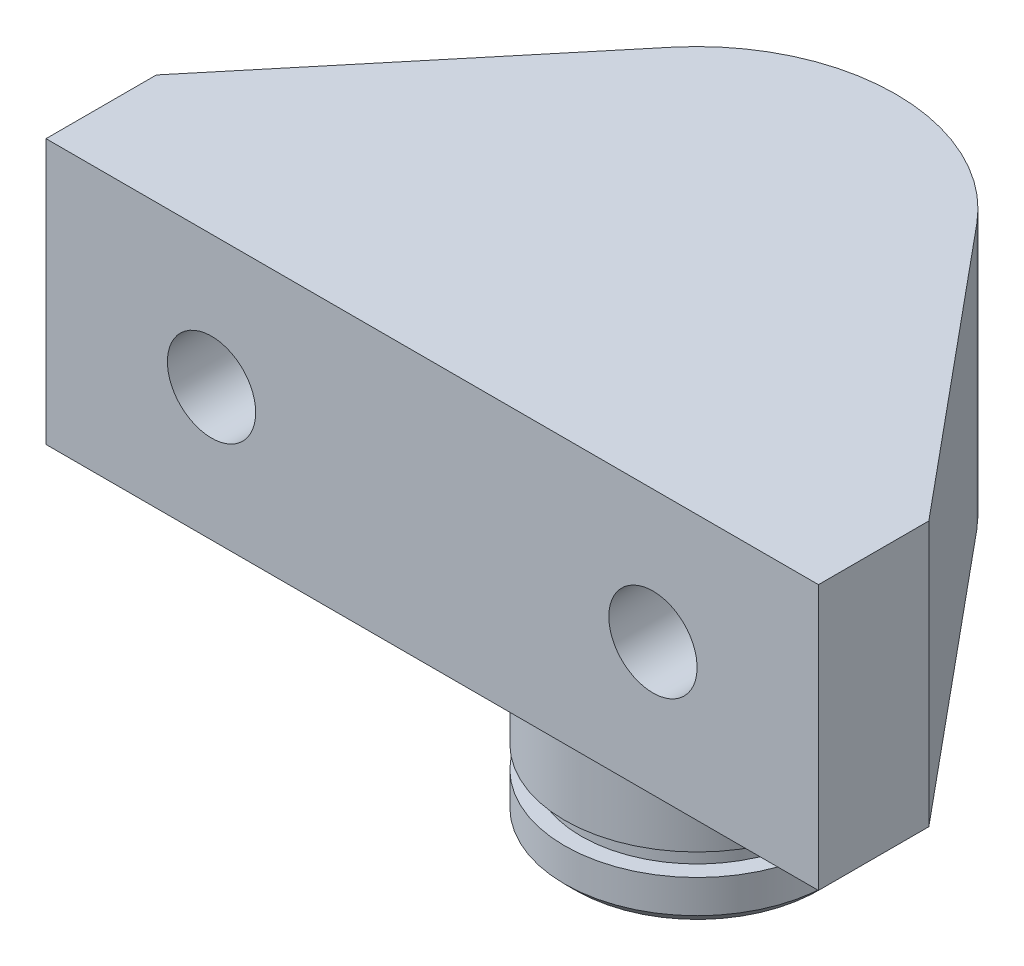
ISO-10303-21;
HEADER;
FILE_DESCRIPTION(('STEP AP214'),'2;1');
FILE_NAME('part.step','',(''),(''),'','','');
FILE_SCHEMA(('AUTOMOTIVE_DESIGN { 1 0 10303 214 1 1 1 1 }'));
ENDSEC;
DATA;
#1=APPLICATION_CONTEXT('core data for automotive mechanical design processes');
#2=APPLICATION_PROTOCOL_DEFINITION('international standard','automotive_design',2000,#1);
#3=PRODUCT_CONTEXT('',#1,'mechanical');
#4=PRODUCT('Part','Part','',(#3));
#5=PRODUCT_RELATED_PRODUCT_CATEGORY('part','',(#4));
#6=PRODUCT_DEFINITION_FORMATION('','',#4);
#7=PRODUCT_DEFINITION_CONTEXT('part definition',#1,'design');
#8=PRODUCT_DEFINITION('design','',#6,#7);
#9=PRODUCT_DEFINITION_SHAPE('','',#8);
#10=(LENGTH_UNIT() NAMED_UNIT(*) SI_UNIT(.MILLI.,.METRE.));
#11=(NAMED_UNIT(*) PLANE_ANGLE_UNIT() SI_UNIT($,.RADIAN.));
#12=(NAMED_UNIT(*) SI_UNIT($,.STERADIAN.) SOLID_ANGLE_UNIT());
#13=UNCERTAINTY_MEASURE_WITH_UNIT(LENGTH_MEASURE(1.E-05),#10,'distance_accuracy_value','');
#14=(GEOMETRIC_REPRESENTATION_CONTEXT(3) GLOBAL_UNCERTAINTY_ASSIGNED_CONTEXT((#13)) GLOBAL_UNIT_ASSIGNED_CONTEXT((#10,
#11,#12)) REPRESENTATION_CONTEXT('',''));
#15=CARTESIAN_POINT('',(0.,0.,0.));
#16=DIRECTION('',(0.,0.,1.));
#17=DIRECTION('',(1.,0.,0.));
#18=AXIS2_PLACEMENT_3D('',#15,#16,#17);
#19=CARTESIAN_POINT('',(-17.5,12.,-6.09769995019883));
#20=DIRECTION('',(1.,0.,0.));
#21=DIRECTION('',(0.,0.,-1.));
#22=AXIS2_PLACEMENT_3D('',#19,#20,#21);
#23=PLANE('',#22);
#24=DIRECTION('',(0.,0.,1.));
#25=VECTOR('',#24,1.);
#26=CARTESIAN_POINT('',(-17.5,0.,-6.09769995019883));
#27=LINE('',#26,#25);
#28=CARTESIAN_POINT('',(-17.5,0.,-6.09769995019883));
#29=VERTEX_POINT('',#28);
#30=CARTESIAN_POINT('',(-17.5,0.,-1.09769995019883));
#31=VERTEX_POINT('',#30);
#32=EDGE_CURVE('E123',#29,#31,#27,.T.);
#33=ORIENTED_EDGE('',*,*,#32,.T.);
#34=DIRECTION('',(0.,-1.,0.));
#35=VECTOR('',#34,1.);
#36=CARTESIAN_POINT('',(-17.5,12.,-1.09769995019883));
#37=LINE('',#36,#35);
#38=CARTESIAN_POINT('',(-17.5,12.,-1.09769995019883));
#39=VERTEX_POINT('',#38);
#40=EDGE_CURVE('E141',#39,#31,#37,.T.);
#41=ORIENTED_EDGE('',*,*,#40,.F.);
#42=DIRECTION('',(0.,0.,1.));
#43=VECTOR('',#42,1.);
#44=CARTESIAN_POINT('',(-17.5,12.,-6.09769995019883));
#45=LINE('',#44,#43);
#46=CARTESIAN_POINT('',(-17.5,12.,-6.09769995019883));
#47=VERTEX_POINT('',#46);
#48=EDGE_CURVE('E134',#47,#39,#45,.T.);
#49=ORIENTED_EDGE('',*,*,#48,.F.);
#50=DIRECTION('',(0.,-1.,0.));
#51=VECTOR('',#50,1.);
#52=CARTESIAN_POINT('',(-17.5,12.,-6.09769995019883));
#53=LINE('',#52,#51);
#54=EDGE_CURVE('E119',#47,#29,#53,.T.);
#55=ORIENTED_EDGE('',*,*,#54,.T.);
#56=EDGE_LOOP('',(#33,#41,#49,#55));
#57=FACE_BOUND('',#56,.T.);
#58=ADVANCED_FACE('F37',(#57),#23,.F.);
#59=CARTESIAN_POINT('',(17.5,12.,-1.09769995019884));
#60=DIRECTION('',(0.,0.,-1.));
#61=DIRECTION('',(-1.,0.,0.));
#62=AXIS2_PLACEMENT_3D('',#59,#60,#61);
#63=PLANE('',#62);
#64=CARTESIAN_POINT('',(10.,6.,-1.09769995019883));
#65=DIRECTION('',(0.,0.,1.));
#66=DIRECTION('',(-1.,0.,0.));
#67=AXIS2_PLACEMENT_3D('',#64,#65,#66);
#68=CIRCLE('',#67,2.);
#69=CARTESIAN_POINT('',(8.,6.,-1.09769995019883));
#70=VERTEX_POINT('',#69);
#71=EDGE_CURVE('E227',#70,#70,#68,.T.);
#72=ORIENTED_EDGE('',*,*,#71,.F.);
#73=EDGE_LOOP('',(#72));
#74=FACE_BOUND('',#73,.T.);
#75=CARTESIAN_POINT('',(-10.,6.,-1.09769995019883));
#76=DIRECTION('',(0.,0.,1.));
#77=DIRECTION('',(1.,0.,0.));
#78=AXIS2_PLACEMENT_3D('',#75,#76,#77);
#79=CIRCLE('',#78,2.);
#80=CARTESIAN_POINT('',(-8.,6.,-1.09769995019883));
#81=VERTEX_POINT('',#80);
#82=EDGE_CURVE('E226',#81,#81,#79,.T.);
#83=ORIENTED_EDGE('',*,*,#82,.F.);
#84=EDGE_LOOP('',(#83));
#85=FACE_BOUND('',#84,.T.);
#86=DIRECTION('',(1.,0.,0.));
#87=VECTOR('',#86,1.);
#88=CARTESIAN_POINT('',(17.5,0.,-1.09769995019884));
#89=LINE('',#88,#87);
#90=CARTESIAN_POINT('',(17.5,0.,-1.09769995019884));
#91=VERTEX_POINT('',#90);
#92=EDGE_CURVE('E126',#31,#91,#89,.T.);
#93=ORIENTED_EDGE('',*,*,#92,.T.);
#94=DIRECTION('',(0.,-1.,0.));
#95=VECTOR('',#94,1.);
#96=CARTESIAN_POINT('',(17.5,12.,-1.09769995019884));
#97=LINE('',#96,#95);
#98=CARTESIAN_POINT('',(17.5,12.,-1.09769995019884));
#99=VERTEX_POINT('',#98);
#100=EDGE_CURVE('E138',#99,#91,#97,.T.);
#101=ORIENTED_EDGE('',*,*,#100,.F.);
#102=DIRECTION('',(1.,0.,0.));
#103=VECTOR('',#102,1.);
#104=CARTESIAN_POINT('',(17.5,12.,-1.09769995019884));
#105=LINE('',#104,#103);
#106=EDGE_CURVE('E92',#39,#99,#105,.T.);
#107=ORIENTED_EDGE('',*,*,#106,.F.);
#108=ORIENTED_EDGE('',*,*,#40,.T.);
#109=EDGE_LOOP('',(#93,#101,#107,#108));
#110=FACE_BOUND('',#109,.T.);
#111=ADVANCED_FACE('F168',(#74,#85,#110),#63,.F.);
#112=CARTESIAN_POINT('',(17.5,12.,-6.09769995019884));
#113=DIRECTION('',(-1.,0.,0.));
#114=DIRECTION('',(0.,0.,1.));
#115=AXIS2_PLACEMENT_3D('',#112,#113,#114);
#116=PLANE('',#115);
#117=DIRECTION('',(0.,0.,-1.));
#118=VECTOR('',#117,1.);
#119=CARTESIAN_POINT('',(17.5,0.,-6.09769995019884));
#120=LINE('',#119,#118);
#121=CARTESIAN_POINT('',(17.5,0.,-6.09769995019884));
#122=VERTEX_POINT('',#121);
#123=EDGE_CURVE('E129',#91,#122,#120,.T.);
#124=ORIENTED_EDGE('',*,*,#123,.T.);
#125=DIRECTION('',(0.,-1.,0.));
#126=VECTOR('',#125,1.);
#127=CARTESIAN_POINT('',(17.5,12.,-6.09769995019884));
#128=LINE('',#127,#126);
#129=CARTESIAN_POINT('',(17.5,12.,-6.09769995019884));
#130=VERTEX_POINT('',#129);
#131=EDGE_CURVE('E114',#130,#122,#128,.T.);
#132=ORIENTED_EDGE('',*,*,#131,.F.);
#133=DIRECTION('',(0.,0.,-1.));
#134=VECTOR('',#133,1.);
#135=CARTESIAN_POINT('',(17.5,12.,-6.09769995019884));
#136=LINE('',#135,#134);
#137=EDGE_CURVE('E105',#99,#130,#136,.T.);
#138=ORIENTED_EDGE('',*,*,#137,.F.);
#139=ORIENTED_EDGE('',*,*,#100,.T.);
#140=EDGE_LOOP('',(#124,#132,#138,#139));
#141=FACE_BOUND('',#140,.T.);
#142=ADVANCED_FACE('F173',(#141),#116,.F.);
#143=CARTESIAN_POINT('',(17.5,12.,-6.09769995019884));
#144=DIRECTION('',(-0.769664929294171,0.,0.638448037521143));
#145=DIRECTION('',(0.638448037521143,0.,0.769664929294171));
#146=AXIS2_PLACEMENT_3D('',#143,#144,#145);
#147=PLANE('',#146);
#148=DIRECTION('',(-0.638448037521143,0.,-0.769664929294171));
#149=VECTOR('',#148,1.);
#150=CARTESIAN_POINT('',(17.5,0.,-6.09769995019884));
#151=LINE('',#150,#149);
#152=CARTESIAN_POINT('',(6.92698436364753,0.,-18.8437322878891));
#153=VERTEX_POINT('',#152);
#154=EDGE_CURVE('E113',#122,#153,#151,.T.);
#155=ORIENTED_EDGE('',*,*,#154,.T.);
#156=DIRECTION('',(0.,-1.,0.));
#157=VECTOR('',#156,1.);
#158=CARTESIAN_POINT('',(6.92698436364753,12.,-18.8437322878891));
#159=LINE('',#158,#157);
#160=CARTESIAN_POINT('',(6.92698436364753,12.,-18.8437322878891));
#161=VERTEX_POINT('',#160);
#162=EDGE_CURVE('E110',#161,#153,#159,.T.);
#163=ORIENTED_EDGE('',*,*,#162,.F.);
#164=DIRECTION('',(-0.638448037521143,0.,-0.769664929294171));
#165=VECTOR('',#164,1.);
#166=CARTESIAN_POINT('',(17.5,12.,-6.09769995019884));
#167=LINE('',#166,#165);
#168=EDGE_CURVE('E99',#130,#161,#167,.T.);
#169=ORIENTED_EDGE('',*,*,#168,.F.);
#170=ORIENTED_EDGE('',*,*,#131,.T.);
#171=EDGE_LOOP('',(#155,#163,#169,#170));
#172=FACE_BOUND('',#171,.T.);
#173=ADVANCED_FACE('F111',(#172),#147,.F.);
#174=CARTESIAN_POINT('',(0.,12.,-13.0976999501988));
#175=DIRECTION('',(0.,-1.,0.));
#176=DIRECTION('',(0.,0.,-1.));
#177=AXIS2_PLACEMENT_3D('',#174,#175,#176);
#178=CYLINDRICAL_SURFACE('',#177,8.99999999999999);
#179=CARTESIAN_POINT('',(0.,0.,-13.0976999501988));
#180=DIRECTION('',(0.,1.,0.));
#181=DIRECTION('',(0.,0.,-1.));
#182=AXIS2_PLACEMENT_3D('',#179,#180,#181);
#183=CIRCLE('',#182,8.99999999999999);
#184=CARTESIAN_POINT('',(-6.92698436364753,0.,-18.8437322878891));
#185=VERTEX_POINT('',#184);
#186=EDGE_CURVE('E77',#153,#185,#183,.T.);
#187=ORIENTED_EDGE('',*,*,#186,.T.);
#188=DIRECTION('',(0.,-1.,0.));
#189=VECTOR('',#188,1.);
#190=CARTESIAN_POINT('',(-6.92698436364753,12.,-18.8437322878891));
#191=LINE('',#190,#189);
#192=CARTESIAN_POINT('',(-6.92698436364753,12.,-18.8437322878891));
#193=VERTEX_POINT('',#192);
#194=EDGE_CURVE('E115',#193,#185,#191,.T.);
#195=ORIENTED_EDGE('',*,*,#194,.F.);
#196=CARTESIAN_POINT('',(0.,12.,-13.0976999501988));
#197=DIRECTION('',(0.,1.,0.));
#198=DIRECTION('',(0.,0.,-1.));
#199=AXIS2_PLACEMENT_3D('',#196,#197,#198);
#200=CIRCLE('',#199,8.99999999999999);
#201=EDGE_CURVE('E103',#161,#193,#200,.T.);
#202=ORIENTED_EDGE('',*,*,#201,.F.);
#203=ORIENTED_EDGE('',*,*,#162,.T.);
#204=EDGE_LOOP('',(#187,#195,#202,#203));
#205=FACE_BOUND('',#204,.T.);
#206=ADVANCED_FACE('F117',(#205),#178,.T.);
#207=CARTESIAN_POINT('',(-17.5,12.,-6.09769995019883));
#208=DIRECTION('',(0.769664929294171,0.,0.638448037521143));
#209=DIRECTION('',(0.638448037521143,0.,-0.769664929294171));
#210=AXIS2_PLACEMENT_3D('',#207,#208,#209);
#211=PLANE('',#210);
#212=DIRECTION('',(-0.638448037521143,0.,0.769664929294171));
#213=VECTOR('',#212,1.);
#214=CARTESIAN_POINT('',(-17.5,0.,-6.09769995019883));
#215=LINE('',#214,#213);
#216=EDGE_CURVE('E83',#185,#29,#215,.T.);
#217=ORIENTED_EDGE('',*,*,#216,.T.);
#218=ORIENTED_EDGE('',*,*,#54,.F.);
#219=DIRECTION('',(-0.638448037521143,0.,0.769664929294171));
#220=VECTOR('',#219,1.);
#221=CARTESIAN_POINT('',(-17.5,12.,-6.09769995019883));
#222=LINE('',#221,#220);
#223=EDGE_CURVE('E54',#193,#47,#222,.T.);
#224=ORIENTED_EDGE('',*,*,#223,.F.);
#225=ORIENTED_EDGE('',*,*,#194,.T.);
#226=EDGE_LOOP('',(#217,#218,#224,#225));
#227=FACE_BOUND('',#226,.T.);
#228=ADVANCED_FACE('F184',(#227),#211,.F.);
#229=CARTESIAN_POINT('',(0.,12.,-13.0976999501988));
#230=DIRECTION('',(0.,-1.,0.));
#231=DIRECTION('',(0.,0.,-1.));
#232=AXIS2_PLACEMENT_3D('',#229,#230,#231);
#233=PLANE('',#232);
#234=ORIENTED_EDGE('',*,*,#48,.T.);
#235=ORIENTED_EDGE('',*,*,#106,.T.);
#236=ORIENTED_EDGE('',*,*,#137,.T.);
#237=ORIENTED_EDGE('',*,*,#168,.T.);
#238=ORIENTED_EDGE('',*,*,#201,.T.);
#239=ORIENTED_EDGE('',*,*,#223,.T.);
#240=EDGE_LOOP('',(#234,#235,#236,#237,#238,#239));
#241=FACE_BOUND('',#240,.T.);
#242=ADVANCED_FACE('F101',(#241),#233,.F.);
#243=CARTESIAN_POINT('',(0.,0.,-13.0976999501988));
#244=DIRECTION('',(0.,-1.,0.));
#245=DIRECTION('',(0.,0.,-1.));
#246=AXIS2_PLACEMENT_3D('',#243,#244,#245);
#247=PLANE('',#246);
#248=CARTESIAN_POINT('',(0.,0.,-13.0976999501988));
#249=DIRECTION('',(0.,-1.,0.));
#250=DIRECTION('',(0.,0.,-1.));
#251=AXIS2_PLACEMENT_3D('',#248,#249,#250);
#252=CIRCLE('',#251,6.);
#253=CARTESIAN_POINT('',(0.,0.,-19.0976999501988));
#254=VERTEX_POINT('',#253);
#255=EDGE_CURVE('E143',#254,#254,#252,.T.);
#256=ORIENTED_EDGE('',*,*,#255,.F.);
#257=EDGE_LOOP('',(#256));
#258=FACE_BOUND('',#257,.T.);
#259=ORIENTED_EDGE('',*,*,#32,.F.);
#260=ORIENTED_EDGE('',*,*,#216,.F.);
#261=ORIENTED_EDGE('',*,*,#186,.F.);
#262=ORIENTED_EDGE('',*,*,#154,.F.);
#263=ORIENTED_EDGE('',*,*,#123,.F.);
#264=ORIENTED_EDGE('',*,*,#92,.F.);
#265=EDGE_LOOP('',(#259,#260,#261,#262,#263,#264));
#266=FACE_BOUND('',#265,.T.);
#267=ADVANCED_FACE('F187',(#258,#266),#247,.T.);
#268=CARTESIAN_POINT('',(0.,-9.,-13.0976999501988));
#269=DIRECTION('',(0.,1.,0.));
#270=DIRECTION('',(0.,0.,1.));
#271=AXIS2_PLACEMENT_3D('',#268,#269,#270);
#272=CYLINDRICAL_SURFACE('',#271,6.);
#273=CARTESIAN_POINT('',(0.,-9.,-13.0976999501988));
#274=DIRECTION('',(0.,1.,0.));
#275=DIRECTION('',(0.,0.,1.));
#276=AXIS2_PLACEMENT_3D('',#273,#274,#275);
#277=CIRCLE('',#276,6.);
#278=CARTESIAN_POINT('',(0.,-9.,-7.09769995019883));
#279=VERTEX_POINT('',#278);
#280=EDGE_CURVE('E127',#279,#279,#277,.T.);
#281=ORIENTED_EDGE('',*,*,#280,.T.);
#282=EDGE_LOOP('',(#281));
#283=FACE_BOUND('',#282,.T.);
#284=ORIENTED_EDGE('',*,*,#255,.T.);
#285=EDGE_LOOP('',(#284));
#286=FACE_BOUND('',#285,.T.);
#287=ADVANCED_FACE('F190',(#283,#286),#272,.T.);
#288=CARTESIAN_POINT('',(0.,-9.,-13.0976999501988));
#289=DIRECTION('',(0.,1.,0.));
#290=DIRECTION('',(0.,0.,1.));
#291=AXIS2_PLACEMENT_3D('',#288,#289,#290);
#292=PLANE('',#291);
#293=CARTESIAN_POINT('',(0.,-9.,-13.0976999501988));
#294=DIRECTION('',(0.,1.,0.));
#295=DIRECTION('',(0.,0.,1.));
#296=AXIS2_PLACEMENT_3D('',#293,#294,#295);
#297=CIRCLE('',#296,5.25);
#298=CARTESIAN_POINT('',(0.,-9.,-7.84769995019883));
#299=VERTEX_POINT('',#298);
#300=EDGE_CURVE('E146',#299,#299,#297,.F.);
#301=ORIENTED_EDGE('',*,*,#300,.F.);
#302=EDGE_LOOP('',(#301));
#303=FACE_BOUND('',#302,.T.);
#304=ORIENTED_EDGE('',*,*,#280,.F.);
#305=EDGE_LOOP('',(#304));
#306=FACE_BOUND('',#305,.T.);
#307=ADVANCED_FACE('F196',(#303,#306),#292,.F.);
#308=CARTESIAN_POINT('',(0.,-10.,-13.0976999501988));
#309=DIRECTION('',(0.,1.,0.));
#310=DIRECTION('',(0.,0.,1.));
#311=AXIS2_PLACEMENT_3D('',#308,#309,#310);
#312=CYLINDRICAL_SURFACE('',#311,5.25);
#313=CARTESIAN_POINT('',(0.,-10.,-13.0976999501988));
#314=DIRECTION('',(0.,-1.,0.));
#315=DIRECTION('',(0.,0.,-1.));
#316=AXIS2_PLACEMENT_3D('',#313,#314,#315);
#317=CIRCLE('',#316,5.25);
#318=CARTESIAN_POINT('',(0.,-10.,-18.3476999501988));
#319=VERTEX_POINT('',#318);
#320=EDGE_CURVE('E240',#319,#319,#317,.T.);
#321=ORIENTED_EDGE('',*,*,#320,.F.);
#322=EDGE_LOOP('',(#321));
#323=FACE_BOUND('',#322,.T.);
#324=ORIENTED_EDGE('',*,*,#300,.T.);
#325=EDGE_LOOP('',(#324));
#326=FACE_BOUND('',#325,.T.);
#327=ADVANCED_FACE('F200',(#323,#326),#312,.T.);
#328=CARTESIAN_POINT('',(0.,-12.,-13.0976999501988));
#329=DIRECTION('',(0.,1.,0.));
#330=DIRECTION('',(0.,0.,1.));
#331=AXIS2_PLACEMENT_3D('',#328,#329,#330);
#332=CYLINDRICAL_SURFACE('',#331,6.);
#333=CARTESIAN_POINT('',(0.,-11.5,-13.0976999501988));
#334=DIRECTION('',(0.,-1.,0.));
#335=DIRECTION('',(0.,0.,-1.));
#336=AXIS2_PLACEMENT_3D('',#333,#334,#335);
#337=CIRCLE('',#336,6.);
#338=CARTESIAN_POINT('',(0.,-11.5,-19.0976999501988));
#339=VERTEX_POINT('',#338);
#340=EDGE_CURVE('E11',#339,#339,#337,.F.);
#341=ORIENTED_EDGE('',*,*,#340,.T.);
#342=EDGE_LOOP('',(#341));
#343=FACE_BOUND('',#342,.T.);
#344=CARTESIAN_POINT('',(0.,-10.,-13.0976999501988));
#345=DIRECTION('',(0.,-1.,0.));
#346=DIRECTION('',(0.,0.,-1.));
#347=AXIS2_PLACEMENT_3D('',#344,#345,#346);
#348=CIRCLE('',#347,6.);
#349=CARTESIAN_POINT('',(0.,-10.,-19.0976999501988));
#350=VERTEX_POINT('',#349);
#351=EDGE_CURVE('E236',#350,#350,#348,.T.);
#352=ORIENTED_EDGE('',*,*,#351,.T.);
#353=EDGE_LOOP('',(#352));
#354=FACE_BOUND('',#353,.T.);
#355=ADVANCED_FACE('F204',(#343,#354),#332,.T.);
#356=CARTESIAN_POINT('',(0.,-12.,-13.0976999501988));
#357=DIRECTION('',(0.,-1.,0.));
#358=DIRECTION('',(0.,0.,-1.));
#359=AXIS2_PLACEMENT_3D('',#356,#357,#358);
#360=PLANE('',#359);
#361=CARTESIAN_POINT('',(0.,-12.,-13.0976999501988));
#362=DIRECTION('',(0.,-1.,0.));
#363=DIRECTION('',(0.,0.,-1.));
#364=AXIS2_PLACEMENT_3D('',#361,#362,#363);
#365=CIRCLE('',#364,5.5);
#366=CARTESIAN_POINT('',(0.,-12.,-18.5976999501988));
#367=VERTEX_POINT('',#366);
#368=EDGE_CURVE('E46',#367,#367,#365,.T.);
#369=ORIENTED_EDGE('',*,*,#368,.T.);
#370=EDGE_LOOP('',(#369));
#371=FACE_BOUND('',#370,.T.);
#372=ADVANCED_FACE('F151',(#371),#360,.T.);
#373=CARTESIAN_POINT('',(0.,-10.,-13.0976999501988));
#374=DIRECTION('',(0.,-1.,0.));
#375=DIRECTION('',(0.,0.,-1.));
#376=AXIS2_PLACEMENT_3D('',#373,#374,#375);
#377=PLANE('',#376);
#378=ORIENTED_EDGE('',*,*,#320,.T.);
#379=EDGE_LOOP('',(#378));
#380=FACE_BOUND('',#379,.T.);
#381=ORIENTED_EDGE('',*,*,#351,.F.);
#382=EDGE_LOOP('',(#381));
#383=FACE_BOUND('',#382,.T.);
#384=ADVANCED_FACE('F155',(#380,#383),#377,.F.);
#385=CARTESIAN_POINT('',(0.,-12.,-13.0976999501988));
#386=DIRECTION('',(0.,1.,0.));
#387=DIRECTION('',(0.,0.,1.));
#388=AXIS2_PLACEMENT_3D('',#385,#386,#387);
#389=CONICAL_SURFACE('',#388,5.5,0.785398163397447);
#390=ORIENTED_EDGE('',*,*,#340,.F.);
#391=EDGE_LOOP('',(#390));
#392=FACE_BOUND('',#391,.T.);
#393=ORIENTED_EDGE('',*,*,#368,.F.);
#394=EDGE_LOOP('',(#393));
#395=FACE_BOUND('',#394,.T.);
#396=ADVANCED_FACE('F39',(#392,#395),#389,.T.);
#397=CARTESIAN_POINT('',(-10.,6.,-6.09769995019883));
#398=DIRECTION('',(0.,0.,1.));
#399=DIRECTION('',(1.,0.,0.));
#400=AXIS2_PLACEMENT_3D('',#397,#398,#399);
#401=CYLINDRICAL_SURFACE('',#400,2.);
#402=CARTESIAN_POINT('',(-10.,6.,-6.09769995019883));
#403=DIRECTION('',(0.,0.,1.));
#404=DIRECTION('',(1.,0.,0.));
#405=AXIS2_PLACEMENT_3D('',#402,#403,#404);
#406=CIRCLE('',#405,2.);
#407=CARTESIAN_POINT('',(-8.,6.,-6.09769995019883));
#408=VERTEX_POINT('',#407);
#409=EDGE_CURVE('E230',#408,#408,#406,.T.);
#410=ORIENTED_EDGE('',*,*,#409,.F.);
#411=EDGE_LOOP('',(#410));
#412=FACE_BOUND('',#411,.T.);
#413=ORIENTED_EDGE('',*,*,#82,.T.);
#414=EDGE_LOOP('',(#413));
#415=FACE_BOUND('',#414,.T.);
#416=ADVANCED_FACE('F154',(#412,#415),#401,.F.);
#417=CARTESIAN_POINT('',(-10.,6.,-6.09769995019883));
#418=DIRECTION('',(0.,0.,1.));
#419=DIRECTION('',(1.,0.,0.));
#420=AXIS2_PLACEMENT_3D('',#417,#418,#419);
#421=PLANE('',#420);
#422=ORIENTED_EDGE('',*,*,#409,.T.);
#423=EDGE_LOOP('',(#422));
#424=FACE_BOUND('',#423,.T.);
#425=ADVANCED_FACE('F161',(#424),#421,.T.);
#426=CARTESIAN_POINT('',(10.,6.,-6.09769995019883));
#427=DIRECTION('',(0.,0.,1.));
#428=DIRECTION('',(1.,0.,0.));
#429=AXIS2_PLACEMENT_3D('',#426,#427,#428);
#430=CYLINDRICAL_SURFACE('',#429,2.);
#431=CARTESIAN_POINT('',(10.,6.,-6.09769995019883));
#432=DIRECTION('',(0.,0.,1.));
#433=DIRECTION('',(-1.,0.,0.));
#434=AXIS2_PLACEMENT_3D('',#431,#432,#433);
#435=CIRCLE('',#434,2.);
#436=CARTESIAN_POINT('',(8.,6.,-6.09769995019883));
#437=VERTEX_POINT('',#436);
#438=EDGE_CURVE('E225',#437,#437,#435,.T.);
#439=ORIENTED_EDGE('',*,*,#438,.F.);
#440=EDGE_LOOP('',(#439));
#441=FACE_BOUND('',#440,.T.);
#442=ORIENTED_EDGE('',*,*,#71,.T.);
#443=EDGE_LOOP('',(#442));
#444=FACE_BOUND('',#443,.T.);
#445=ADVANCED_FACE('F213',(#441,#444),#430,.F.);
#446=CARTESIAN_POINT('',(10.,6.,-6.09769995019883));
#447=DIRECTION('',(0.,0.,-1.));
#448=DIRECTION('',(-1.,0.,0.));
#449=AXIS2_PLACEMENT_3D('',#446,#447,#448);
#450=PLANE('',#449);
#451=ORIENTED_EDGE('',*,*,#438,.T.);
#452=EDGE_LOOP('',(#451));
#453=FACE_BOUND('',#452,.T.);
#454=ADVANCED_FACE('F217',(#453),#450,.F.);
#455=CLOSED_SHELL('',(#58,#111,#142,#173,#206,#228,#242,#267,#287,#307,#327,#355,#372,#384,#396,
#416,#425,#445,#454));
#456=MANIFOLD_SOLID_BREP('B2',#455);
#457=ADVANCED_BREP_SHAPE_REPRESENTATION('',(#18,#456),#14);
#458=SHAPE_DEFINITION_REPRESENTATION(#9,#457);
ENDSEC;
END-ISO-10303-21;
